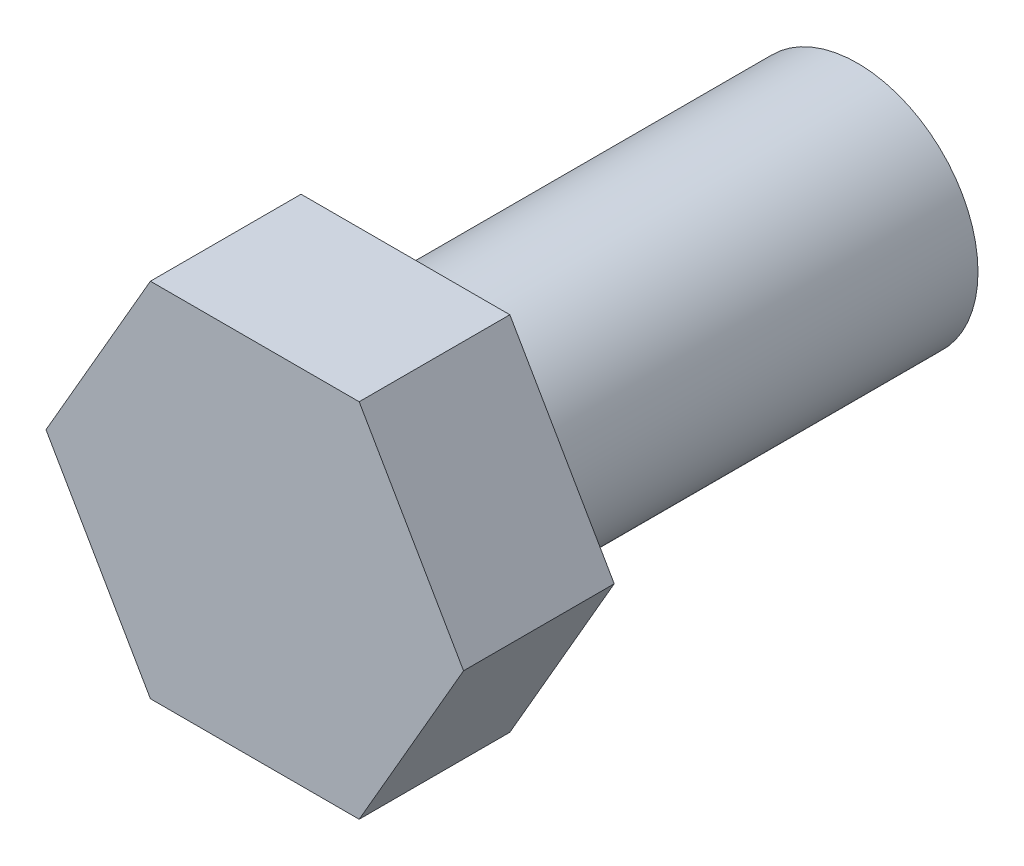
ISO-10303-21;
HEADER;
FILE_DESCRIPTION(('STEP AP214'),'2;1');
FILE_NAME('part.step','',(''),(''),'','','');
FILE_SCHEMA(('AUTOMOTIVE_DESIGN { 1 0 10303 214 1 1 1 1 }'));
ENDSEC;
DATA;
#1=APPLICATION_CONTEXT('core data for automotive mechanical design processes');
#2=APPLICATION_PROTOCOL_DEFINITION('international standard','automotive_design',2000,#1);
#3=PRODUCT_CONTEXT('',#1,'mechanical');
#4=PRODUCT('Part','Part','',(#3));
#5=PRODUCT_RELATED_PRODUCT_CATEGORY('part','',(#4));
#6=PRODUCT_DEFINITION_FORMATION('','',#4);
#7=PRODUCT_DEFINITION_CONTEXT('part definition',#1,'design');
#8=PRODUCT_DEFINITION('design','',#6,#7);
#9=PRODUCT_DEFINITION_SHAPE('','',#8);
#10=(LENGTH_UNIT() NAMED_UNIT(*) SI_UNIT(.MILLI.,.METRE.));
#11=(NAMED_UNIT(*) PLANE_ANGLE_UNIT() SI_UNIT($,.RADIAN.));
#12=(NAMED_UNIT(*) SI_UNIT($,.STERADIAN.) SOLID_ANGLE_UNIT());
#13=UNCERTAINTY_MEASURE_WITH_UNIT(LENGTH_MEASURE(1.E-05),#10,'distance_accuracy_value','');
#14=(GEOMETRIC_REPRESENTATION_CONTEXT(3) GLOBAL_UNCERTAINTY_ASSIGNED_CONTEXT((#13)) GLOBAL_UNIT_ASSIGNED_CONTEXT((#10,
#11,#12)) REPRESENTATION_CONTEXT('',''));
#15=CARTESIAN_POINT('',(0.,0.,0.));
#16=DIRECTION('',(0.,0.,1.));
#17=DIRECTION('',(1.,0.,0.));
#18=AXIS2_PLACEMENT_3D('',#15,#16,#17);
#19=CARTESIAN_POINT('',(0.,0.,-30.));
#20=DIRECTION('',(0.,0.,1.));
#21=DIRECTION('',(1.,0.,0.));
#22=AXIS2_PLACEMENT_3D('',#19,#20,#21);
#23=CYLINDRICAL_SURFACE('',#22,8.);
#24=CARTESIAN_POINT('',(0.,0.,-30.));
#25=DIRECTION('',(0.,0.,1.));
#26=DIRECTION('',(1.,0.,0.));
#27=AXIS2_PLACEMENT_3D('',#24,#25,#26);
#28=CIRCLE('',#27,8.);
#29=CARTESIAN_POINT('',(8.,0.,-30.));
#30=VERTEX_POINT('',#29);
#31=EDGE_CURVE('E11',#30,#30,#28,.T.);
#32=ORIENTED_EDGE('',*,*,#31,.T.);
#33=EDGE_LOOP('',(#32));
#34=FACE_BOUND('',#33,.T.);
#35=CARTESIAN_POINT('',(0.,0.,0.));
#36=DIRECTION('',(0.,0.,1.));
#37=DIRECTION('',(1.,0.,0.));
#38=AXIS2_PLACEMENT_3D('',#35,#36,#37);
#39=CIRCLE('',#38,8.);
#40=CARTESIAN_POINT('',(8.,0.,0.));
#41=VERTEX_POINT('',#40);
#42=EDGE_CURVE('E40',#41,#41,#39,.T.);
#43=ORIENTED_EDGE('',*,*,#42,.F.);
#44=EDGE_LOOP('',(#43));
#45=FACE_BOUND('',#44,.T.);
#46=ADVANCED_FACE('F37',(#34,#45),#23,.T.);
#47=CARTESIAN_POINT('',(0.,0.,-30.));
#48=DIRECTION('',(0.,0.,1.));
#49=DIRECTION('',(1.,0.,0.));
#50=AXIS2_PLACEMENT_3D('',#47,#48,#49);
#51=PLANE('',#50);
#52=ORIENTED_EDGE('',*,*,#31,.F.);
#53=EDGE_LOOP('',(#52));
#54=FACE_BOUND('',#53,.T.);
#55=ADVANCED_FACE('F148',(#54),#51,.F.);
#56=CARTESIAN_POINT('',(6.92820323027551,12.,10.));
#57=DIRECTION('',(0.,-1.,0.));
#58=DIRECTION('',(0.,0.,-1.));
#59=AXIS2_PLACEMENT_3D('',#56,#57,#58);
#60=PLANE('',#59);
#61=DIRECTION('',(-1.,0.,0.));
#62=VECTOR('',#61,1.);
#63=CARTESIAN_POINT('',(6.92820323027551,12.,0.));
#64=LINE('',#63,#62);
#65=CARTESIAN_POINT('',(6.92820323027551,12.,0.));
#66=VERTEX_POINT('',#65);
#67=CARTESIAN_POINT('',(-6.92820323027551,12.,0.));
#68=VERTEX_POINT('',#67);
#69=EDGE_CURVE('E122',#66,#68,#64,.T.);
#70=ORIENTED_EDGE('',*,*,#69,.T.);
#71=DIRECTION('',(0.,0.,-1.));
#72=VECTOR('',#71,1.);
#73=CARTESIAN_POINT('',(-6.92820323027551,12.,10.));
#74=LINE('',#73,#72);
#75=CARTESIAN_POINT('',(-6.92820323027551,12.,10.));
#76=VERTEX_POINT('',#75);
#77=EDGE_CURVE('E139',#76,#68,#74,.T.);
#78=ORIENTED_EDGE('',*,*,#77,.F.);
#79=DIRECTION('',(-1.,0.,0.));
#80=VECTOR('',#79,1.);
#81=CARTESIAN_POINT('',(6.92820323027551,12.,10.));
#82=LINE('',#81,#80);
#83=CARTESIAN_POINT('',(6.92820323027551,12.,10.));
#84=VERTEX_POINT('',#83);
#85=EDGE_CURVE('E132',#84,#76,#82,.T.);
#86=ORIENTED_EDGE('',*,*,#85,.F.);
#87=DIRECTION('',(0.,0.,-1.));
#88=VECTOR('',#87,1.);
#89=CARTESIAN_POINT('',(6.92820323027551,12.,10.));
#90=LINE('',#89,#88);
#91=EDGE_CURVE('E118',#84,#66,#90,.T.);
#92=ORIENTED_EDGE('',*,*,#91,.T.);
#93=EDGE_LOOP('',(#70,#78,#86,#92));
#94=FACE_BOUND('',#93,.T.);
#95=ADVANCED_FACE('F153',(#94),#60,.F.);
#96=CARTESIAN_POINT('',(-6.92820323027551,12.,10.));
#97=DIRECTION('',(0.866025403784439,-0.5,0.));
#98=DIRECTION('',(0.5,0.866025403784439,0.));
#99=AXIS2_PLACEMENT_3D('',#96,#97,#98);
#100=PLANE('',#99);
#101=DIRECTION('',(-0.5,-0.866025403784439,0.));
#102=VECTOR('',#101,1.);
#103=CARTESIAN_POINT('',(-6.92820323027551,12.,0.));
#104=LINE('',#103,#102);
#105=CARTESIAN_POINT('',(-13.856406460551,0.,0.));
#106=VERTEX_POINT('',#105);
#107=EDGE_CURVE('E125',#68,#106,#104,.T.);
#108=ORIENTED_EDGE('',*,*,#107,.T.);
#109=DIRECTION('',(0.,0.,-1.));
#110=VECTOR('',#109,1.);
#111=CARTESIAN_POINT('',(-13.856406460551,0.,10.));
#112=LINE('',#111,#110);
#113=CARTESIAN_POINT('',(-13.856406460551,0.,10.));
#114=VERTEX_POINT('',#113);
#115=EDGE_CURVE('E136',#114,#106,#112,.T.);
#116=ORIENTED_EDGE('',*,*,#115,.F.);
#117=DIRECTION('',(-0.5,-0.866025403784439,0.));
#118=VECTOR('',#117,1.);
#119=CARTESIAN_POINT('',(-6.92820323027551,12.,10.));
#120=LINE('',#119,#118);
#121=EDGE_CURVE('E91',#76,#114,#120,.T.);
#122=ORIENTED_EDGE('',*,*,#121,.F.);
#123=ORIENTED_EDGE('',*,*,#77,.T.);
#124=EDGE_LOOP('',(#108,#116,#122,#123));
#125=FACE_BOUND('',#124,.T.);
#126=ADVANCED_FACE('F159',(#125),#100,.F.);
#127=CARTESIAN_POINT('',(-13.856406460551,0.,10.));
#128=DIRECTION('',(0.866025403784439,0.5,0.));
#129=DIRECTION('',(-0.5,0.866025403784439,0.));
#130=AXIS2_PLACEMENT_3D('',#127,#128,#129);
#131=PLANE('',#130);
#132=DIRECTION('',(0.5,-0.866025403784439,0.));
#133=VECTOR('',#132,1.);
#134=CARTESIAN_POINT('',(-13.856406460551,0.,0.));
#135=LINE('',#134,#133);
#136=CARTESIAN_POINT('',(-6.92820323027551,-12.,0.));
#137=VERTEX_POINT('',#136);
#138=EDGE_CURVE('E127',#106,#137,#135,.T.);
#139=ORIENTED_EDGE('',*,*,#138,.T.);
#140=DIRECTION('',(0.,0.,-1.));
#141=VECTOR('',#140,1.);
#142=CARTESIAN_POINT('',(-6.92820323027551,-12.,10.));
#143=LINE('',#142,#141);
#144=CARTESIAN_POINT('',(-6.92820323027551,-12.,10.));
#145=VERTEX_POINT('',#144);
#146=EDGE_CURVE('E113',#145,#137,#143,.T.);
#147=ORIENTED_EDGE('',*,*,#146,.F.);
#148=DIRECTION('',(0.5,-0.866025403784439,0.));
#149=VECTOR('',#148,1.);
#150=CARTESIAN_POINT('',(-13.856406460551,0.,10.));
#151=LINE('',#150,#149);
#152=EDGE_CURVE('E104',#114,#145,#151,.T.);
#153=ORIENTED_EDGE('',*,*,#152,.F.);
#154=ORIENTED_EDGE('',*,*,#115,.T.);
#155=EDGE_LOOP('',(#139,#147,#153,#154));
#156=FACE_BOUND('',#155,.T.);
#157=ADVANCED_FACE('F165',(#156),#131,.F.);
#158=CARTESIAN_POINT('',(-6.92820323027551,-12.,10.));
#159=DIRECTION('',(0.,1.,0.));
#160=DIRECTION('',(-1.,0.,0.));
#161=AXIS2_PLACEMENT_3D('',#158,#159,#160);
#162=PLANE('',#161);
#163=DIRECTION('',(1.,0.,0.));
#164=VECTOR('',#163,1.);
#165=CARTESIAN_POINT('',(-6.92820323027551,-12.,0.));
#166=LINE('',#165,#164);
#167=CARTESIAN_POINT('',(6.9282032302755,-12.,0.));
#168=VERTEX_POINT('',#167);
#169=EDGE_CURVE('E112',#137,#168,#166,.T.);
#170=ORIENTED_EDGE('',*,*,#169,.T.);
#171=DIRECTION('',(0.,0.,-1.));
#172=VECTOR('',#171,1.);
#173=CARTESIAN_POINT('',(6.9282032302755,-12.,10.));
#174=LINE('',#173,#172);
#175=CARTESIAN_POINT('',(6.9282032302755,-12.,10.));
#176=VERTEX_POINT('',#175);
#177=EDGE_CURVE('E109',#176,#168,#174,.T.);
#178=ORIENTED_EDGE('',*,*,#177,.F.);
#179=DIRECTION('',(1.,0.,0.));
#180=VECTOR('',#179,1.);
#181=CARTESIAN_POINT('',(-6.92820323027551,-12.,10.));
#182=LINE('',#181,#180);
#183=EDGE_CURVE('E98',#145,#176,#182,.T.);
#184=ORIENTED_EDGE('',*,*,#183,.F.);
#185=ORIENTED_EDGE('',*,*,#146,.T.);
#186=EDGE_LOOP('',(#170,#178,#184,#185));
#187=FACE_BOUND('',#186,.T.);
#188=ADVANCED_FACE('F110',(#187),#162,.F.);
#189=CARTESIAN_POINT('',(6.9282032302755,-12.,10.));
#190=DIRECTION('',(-0.866025403784439,0.5,0.));
#191=DIRECTION('',(-0.5,-0.866025403784439,0.));
#192=AXIS2_PLACEMENT_3D('',#189,#190,#191);
#193=PLANE('',#192);
#194=DIRECTION('',(0.5,0.866025403784439,0.));
#195=VECTOR('',#194,1.);
#196=CARTESIAN_POINT('',(6.9282032302755,-12.,0.));
#197=LINE('',#196,#195);
#198=CARTESIAN_POINT('',(13.856406460551,0.,0.));
#199=VERTEX_POINT('',#198);
#200=EDGE_CURVE('E76',#168,#199,#197,.T.);
#201=ORIENTED_EDGE('',*,*,#200,.T.);
#202=DIRECTION('',(0.,0.,-1.));
#203=VECTOR('',#202,1.);
#204=CARTESIAN_POINT('',(13.856406460551,0.,10.));
#205=LINE('',#204,#203);
#206=CARTESIAN_POINT('',(13.856406460551,0.,10.));
#207=VERTEX_POINT('',#206);
#208=EDGE_CURVE('E114',#207,#199,#205,.T.);
#209=ORIENTED_EDGE('',*,*,#208,.F.);
#210=DIRECTION('',(0.5,0.866025403784439,0.));
#211=VECTOR('',#210,1.);
#212=CARTESIAN_POINT('',(6.9282032302755,-12.,10.));
#213=LINE('',#212,#211);
#214=EDGE_CURVE('E102',#176,#207,#213,.T.);
#215=ORIENTED_EDGE('',*,*,#214,.F.);
#216=ORIENTED_EDGE('',*,*,#177,.T.);
#217=EDGE_LOOP('',(#201,#209,#215,#216));
#218=FACE_BOUND('',#217,.T.);
#219=ADVANCED_FACE('F116',(#218),#193,.F.);
#220=CARTESIAN_POINT('',(13.856406460551,0.,10.));
#221=DIRECTION('',(-0.866025403784439,-0.5,0.));
#222=DIRECTION('',(0.5,-0.866025403784439,0.));
#223=AXIS2_PLACEMENT_3D('',#220,#221,#222);
#224=PLANE('',#223);
#225=DIRECTION('',(-0.5,0.866025403784439,0.));
#226=VECTOR('',#225,1.);
#227=CARTESIAN_POINT('',(13.856406460551,0.,0.));
#228=LINE('',#227,#226);
#229=EDGE_CURVE('E82',#199,#66,#228,.T.);
#230=ORIENTED_EDGE('',*,*,#229,.T.);
#231=ORIENTED_EDGE('',*,*,#91,.F.);
#232=DIRECTION('',(-0.5,0.866025403784439,0.));
#233=VECTOR('',#232,1.);
#234=CARTESIAN_POINT('',(13.856406460551,0.,10.));
#235=LINE('',#234,#233);
#236=EDGE_CURVE('E53',#207,#84,#235,.T.);
#237=ORIENTED_EDGE('',*,*,#236,.F.);
#238=ORIENTED_EDGE('',*,*,#208,.T.);
#239=EDGE_LOOP('',(#230,#231,#237,#238));
#240=FACE_BOUND('',#239,.T.);
#241=ADVANCED_FACE('F173',(#240),#224,.F.);
#242=CARTESIAN_POINT('',(6.92820323027551,12.,10.));
#243=DIRECTION('',(0.,0.,-1.));
#244=DIRECTION('',(-1.,0.,0.));
#245=AXIS2_PLACEMENT_3D('',#242,#243,#244);
#246=PLANE('',#245);
#247=ORIENTED_EDGE('',*,*,#85,.T.);
#248=ORIENTED_EDGE('',*,*,#121,.T.);
#249=ORIENTED_EDGE('',*,*,#152,.T.);
#250=ORIENTED_EDGE('',*,*,#183,.T.);
#251=ORIENTED_EDGE('',*,*,#214,.T.);
#252=ORIENTED_EDGE('',*,*,#236,.T.);
#253=EDGE_LOOP('',(#247,#248,#249,#250,#251,#252));
#254=FACE_BOUND('',#253,.T.);
#255=ADVANCED_FACE('F100',(#254),#246,.F.);
#256=CARTESIAN_POINT('',(6.92820323027551,12.,0.));
#257=DIRECTION('',(0.,0.,-1.));
#258=DIRECTION('',(-1.,0.,0.));
#259=AXIS2_PLACEMENT_3D('',#256,#257,#258);
#260=PLANE('',#259);
#261=ORIENTED_EDGE('',*,*,#42,.T.);
#262=EDGE_LOOP('',(#261));
#263=FACE_BOUND('',#262,.T.);
#264=ORIENTED_EDGE('',*,*,#69,.F.);
#265=ORIENTED_EDGE('',*,*,#229,.F.);
#266=ORIENTED_EDGE('',*,*,#200,.F.);
#267=ORIENTED_EDGE('',*,*,#169,.F.);
#268=ORIENTED_EDGE('',*,*,#138,.F.);
#269=ORIENTED_EDGE('',*,*,#107,.F.);
#270=EDGE_LOOP('',(#264,#265,#266,#267,#268,#269));
#271=FACE_BOUND('',#270,.T.);
#272=ADVANCED_FACE('F144',(#263,#271),#260,.T.);
#273=CLOSED_SHELL('',(#46,#55,#95,#126,#157,#188,#219,#241,#255,#272));
#274=MANIFOLD_SOLID_BREP('B2',#273);
#275=ADVANCED_BREP_SHAPE_REPRESENTATION('',(#18,#274),#14);
#276=SHAPE_DEFINITION_REPRESENTATION(#9,#275);
ENDSEC;
END-ISO-10303-21;
